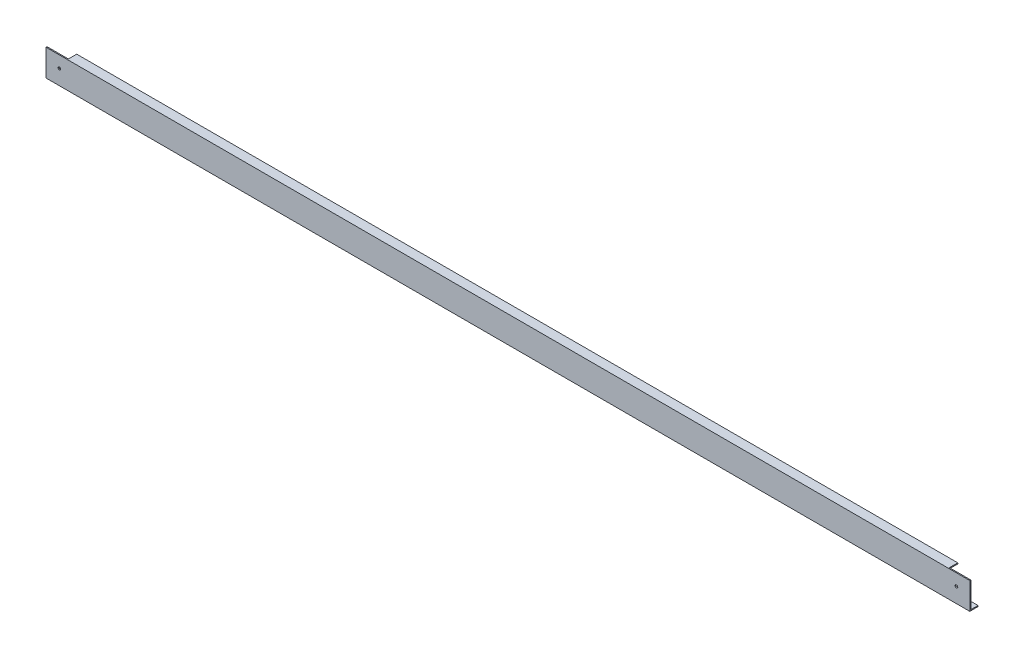
ISO-10303-21;
HEADER;
FILE_DESCRIPTION(('STEP AP214'),'2;1');
FILE_NAME('part.step','',(''),(''),'','','');
FILE_SCHEMA(('AUTOMOTIVE_DESIGN { 1 0 10303 214 1 1 1 1 }'));
ENDSEC;
DATA;
#1=APPLICATION_CONTEXT('core data for automotive mechanical design processes');
#2=APPLICATION_PROTOCOL_DEFINITION('international standard','automotive_design',2000,#1);
#3=PRODUCT_CONTEXT('',#1,'mechanical');
#4=PRODUCT('Part','Part','',(#3));
#5=PRODUCT_RELATED_PRODUCT_CATEGORY('part','',(#4));
#6=PRODUCT_DEFINITION_FORMATION('','',#4);
#7=PRODUCT_DEFINITION_CONTEXT('part definition',#1,'design');
#8=PRODUCT_DEFINITION('design','',#6,#7);
#9=PRODUCT_DEFINITION_SHAPE('','',#8);
#10=(LENGTH_UNIT() NAMED_UNIT(*) SI_UNIT(.MILLI.,.METRE.));
#11=(NAMED_UNIT(*) PLANE_ANGLE_UNIT() SI_UNIT($,.RADIAN.));
#12=(NAMED_UNIT(*) SI_UNIT($,.STERADIAN.) SOLID_ANGLE_UNIT());
#13=UNCERTAINTY_MEASURE_WITH_UNIT(LENGTH_MEASURE(1.E-05),#10,'distance_accuracy_value','');
#14=(GEOMETRIC_REPRESENTATION_CONTEXT(3) GLOBAL_UNCERTAINTY_ASSIGNED_CONTEXT((#13)) GLOBAL_UNIT_ASSIGNED_CONTEXT((#10,
#11,#12)) REPRESENTATION_CONTEXT('',''));
#15=CARTESIAN_POINT('',(0.,0.,0.));
#16=DIRECTION('',(0.,0.,1.));
#17=DIRECTION('',(1.,0.,0.));
#18=AXIS2_PLACEMENT_3D('',#15,#16,#17);
#19=CARTESIAN_POINT('',(4394.2,122.174,-4.826));
#20=DIRECTION('',(0.,1.,0.));
#21=DIRECTION('',(0.,0.,1.));
#22=AXIS2_PLACEMENT_3D('',#19,#20,#21);
#23=PLANE('',#22);
#24=DIRECTION('',(0.,0.,1.));
#25=VECTOR('',#24,1.);
#26=CARTESIAN_POINT('',(101.6,122.174,-44.451));
#27=LINE('',#26,#25);
#28=CARTESIAN_POINT('',(101.6,122.174,-44.45));
#29=VERTEX_POINT('',#28);
#30=CARTESIAN_POINT('',(101.6,122.174,-4.826));
#31=VERTEX_POINT('',#30);
#32=EDGE_CURVE('E168',#29,#31,#27,.T.);
#33=ORIENTED_EDGE('',*,*,#32,.F.);
#34=DIRECTION('',(-1.,0.,0.));
#35=VECTOR('',#34,1.);
#36=CARTESIAN_POINT('',(4394.2,122.174,-44.45));
#37=LINE('',#36,#35);
#38=CARTESIAN_POINT('',(4292.6,122.174,-44.45));
#39=VERTEX_POINT('',#38);
#40=EDGE_CURVE('E142',#39,#29,#37,.T.);
#41=ORIENTED_EDGE('',*,*,#40,.F.);
#42=DIRECTION('',(0.,0.,1.));
#43=VECTOR('',#42,1.);
#44=CARTESIAN_POINT('',(4292.6,122.174,-44.451));
#45=LINE('',#44,#43);
#46=CARTESIAN_POINT('',(4292.6,122.174,-4.826));
#47=VERTEX_POINT('',#46);
#48=EDGE_CURVE('E171',#39,#47,#45,.T.);
#49=ORIENTED_EDGE('',*,*,#48,.T.);
#50=DIRECTION('',(-1.,0.,0.));
#51=VECTOR('',#50,1.);
#52=CARTESIAN_POINT('',(4394.2,122.174,-4.826));
#53=LINE('',#52,#51);
#54=EDGE_CURVE('E109',#47,#31,#53,.T.);
#55=ORIENTED_EDGE('',*,*,#54,.T.);
#56=EDGE_LOOP('',(#33,#41,#49,#55));
#57=FACE_BOUND('',#56,.T.);
#58=ADVANCED_FACE('F35',(#57),#23,.F.);
#59=CARTESIAN_POINT('',(4394.2,127.,-44.45));
#60=DIRECTION('',(0.,0.,1.));
#61=DIRECTION('',(1.,0.,0.));
#62=AXIS2_PLACEMENT_3D('',#59,#60,#61);
#63=PLANE('',#62);
#64=DIRECTION('',(0.,1.,0.));
#65=VECTOR('',#64,1.);
#66=CARTESIAN_POINT('',(101.6,127.,-44.45));
#67=LINE('',#66,#65);
#68=CARTESIAN_POINT('',(101.6,127.,-44.45));
#69=VERTEX_POINT('',#68);
#70=EDGE_CURVE('E166',#29,#69,#67,.T.);
#71=ORIENTED_EDGE('',*,*,#70,.T.);
#72=DIRECTION('',(-1.,0.,0.));
#73=VECTOR('',#72,1.);
#74=CARTESIAN_POINT('',(4394.2,127.,-44.45));
#75=LINE('',#74,#73);
#76=CARTESIAN_POINT('',(4292.6,127.,-44.45));
#77=VERTEX_POINT('',#76);
#78=EDGE_CURVE('E139',#77,#69,#75,.T.);
#79=ORIENTED_EDGE('',*,*,#78,.F.);
#80=DIRECTION('',(0.,-1.,0.));
#81=VECTOR('',#80,1.);
#82=CARTESIAN_POINT('',(4292.6,127.,-44.45));
#83=LINE('',#82,#81);
#84=EDGE_CURVE('E178',#77,#39,#83,.T.);
#85=ORIENTED_EDGE('',*,*,#84,.T.);
#86=ORIENTED_EDGE('',*,*,#40,.T.);
#87=EDGE_LOOP('',(#71,#79,#85,#86));
#88=FACE_BOUND('',#87,.T.);
#89=ADVANCED_FACE('F210',(#88),#63,.F.);
#90=CARTESIAN_POINT('',(4394.2,127.,0.));
#91=DIRECTION('',(0.,-1.,0.));
#92=DIRECTION('',(0.,0.,-1.));
#93=AXIS2_PLACEMENT_3D('',#90,#91,#92);
#94=PLANE('',#93);
#95=DIRECTION('',(0.,0.,1.));
#96=VECTOR('',#95,1.);
#97=CARTESIAN_POINT('',(101.6,127.,-44.451));
#98=LINE('',#97,#96);
#99=CARTESIAN_POINT('',(101.6,127.,-4.826));
#100=VERTEX_POINT('',#99);
#101=EDGE_CURVE('E164',#69,#100,#98,.T.);
#102=ORIENTED_EDGE('',*,*,#101,.T.);
#103=DIRECTION('',(1.,0.,0.));
#104=VECTOR('',#103,1.);
#105=CARTESIAN_POINT('',(0.,127.,-4.826));
#106=LINE('',#105,#104);
#107=CARTESIAN_POINT('',(0.,127.,-4.826));
#108=VERTEX_POINT('',#107);
#109=EDGE_CURVE('E155',#108,#100,#106,.T.);
#110=ORIENTED_EDGE('',*,*,#109,.F.);
#111=DIRECTION('',(0.,0.,1.));
#112=VECTOR('',#111,1.);
#113=CARTESIAN_POINT('',(0.,127.,0.));
#114=LINE('',#113,#112);
#115=CARTESIAN_POINT('',(0.,127.,0.));
#116=VERTEX_POINT('',#115);
#117=EDGE_CURVE('E132',#108,#116,#114,.T.);
#118=ORIENTED_EDGE('',*,*,#117,.T.);
#119=DIRECTION('',(-1.,0.,0.));
#120=VECTOR('',#119,1.);
#121=CARTESIAN_POINT('',(4394.2,127.,0.));
#122=LINE('',#121,#120);
#123=CARTESIAN_POINT('',(4394.2,127.,0.));
#124=VERTEX_POINT('',#123);
#125=EDGE_CURVE('E137',#124,#116,#122,.T.);
#126=ORIENTED_EDGE('',*,*,#125,.F.);
#127=DIRECTION('',(0.,0.,1.));
#128=VECTOR('',#127,1.);
#129=CARTESIAN_POINT('',(4394.2,127.,0.));
#130=LINE('',#129,#128);
#131=CARTESIAN_POINT('',(4394.2,127.,-4.826));
#132=VERTEX_POINT('',#131);
#133=EDGE_CURVE('E116',#132,#124,#130,.T.);
#134=ORIENTED_EDGE('',*,*,#133,.F.);
#135=DIRECTION('',(1.,0.,0.));
#136=VECTOR('',#135,1.);
#137=CARTESIAN_POINT('',(4394.2,127.,-4.826));
#138=LINE('',#137,#136);
#139=CARTESIAN_POINT('',(4292.6,127.,-4.826));
#140=VERTEX_POINT('',#139);
#141=EDGE_CURVE('E114',#140,#132,#138,.T.);
#142=ORIENTED_EDGE('',*,*,#141,.F.);
#143=DIRECTION('',(0.,0.,1.));
#144=VECTOR('',#143,1.);
#145=CARTESIAN_POINT('',(4292.6,127.,-44.451));
#146=LINE('',#145,#144);
#147=EDGE_CURVE('E184',#77,#140,#146,.T.);
#148=ORIENTED_EDGE('',*,*,#147,.F.);
#149=ORIENTED_EDGE('',*,*,#78,.T.);
#150=EDGE_LOOP('',(#102,#110,#118,#126,#134,#142,#148,#149));
#151=FACE_BOUND('',#150,.T.);
#152=ADVANCED_FACE('F161',(#151),#94,.F.);
#153=CARTESIAN_POINT('',(4394.2,0.,0.));
#154=DIRECTION('',(-1.,0.,0.));
#155=DIRECTION('',(0.,0.,1.));
#156=AXIS2_PLACEMENT_3D('',#153,#154,#155);
#157=PLANE('',#156);
#158=DIRECTION('',(0.,1.,0.));
#159=VECTOR('',#158,1.);
#160=CARTESIAN_POINT('',(4394.2,4.826,-4.826));
#161=LINE('',#160,#159);
#162=CARTESIAN_POINT('',(4394.2,4.826,-4.826));
#163=VERTEX_POINT('',#162);
#164=EDGE_CURVE('E50',#163,#132,#161,.T.);
#165=ORIENTED_EDGE('',*,*,#164,.T.);
#166=ORIENTED_EDGE('',*,*,#133,.T.);
#167=DIRECTION('',(0.,-1.,0.));
#168=VECTOR('',#167,1.);
#169=CARTESIAN_POINT('',(4394.2,0.,0.));
#170=LINE('',#169,#168);
#171=CARTESIAN_POINT('',(4394.2,0.,0.));
#172=VERTEX_POINT('',#171);
#173=EDGE_CURVE('E57',#124,#172,#170,.T.);
#174=ORIENTED_EDGE('',*,*,#173,.T.);
#175=DIRECTION('',(0.,0.,-1.));
#176=VECTOR('',#175,1.);
#177=CARTESIAN_POINT('',(4394.2,0.,0.));
#178=LINE('',#177,#176);
#179=CARTESIAN_POINT('',(4394.2,0.,-39.0506937663231));
#180=VERTEX_POINT('',#179);
#181=EDGE_CURVE('E135',#172,#180,#178,.T.);
#182=ORIENTED_EDGE('',*,*,#181,.T.);
#183=DIRECTION('',(0.,1.,0.));
#184=VECTOR('',#183,1.);
#185=CARTESIAN_POINT('',(4394.2,4.826,-39.0506937663231));
#186=LINE('',#185,#184);
#187=CARTESIAN_POINT('',(4394.2,4.826,-39.0506937663231));
#188=VERTEX_POINT('',#187);
#189=EDGE_CURVE('E89',#180,#188,#186,.T.);
#190=ORIENTED_EDGE('',*,*,#189,.T.);
#191=DIRECTION('',(0.,0.,1.));
#192=VECTOR('',#191,1.);
#193=CARTESIAN_POINT('',(4394.2,4.826,-4.826));
#194=LINE('',#193,#192);
#195=EDGE_CURVE('E95',#188,#163,#194,.T.);
#196=ORIENTED_EDGE('',*,*,#195,.T.);
#197=EDGE_LOOP('',(#165,#166,#174,#182,#190,#196));
#198=FACE_BOUND('',#197,.T.);
#199=ADVANCED_FACE('F97',(#198),#157,.F.);
#200=CARTESIAN_POINT('',(4394.2,0.,0.));
#201=DIRECTION('',(0.,1.,0.));
#202=DIRECTION('',(0.,0.,1.));
#203=AXIS2_PLACEMENT_3D('',#200,#201,#202);
#204=PLANE('',#203);
#205=DIRECTION('',(0.,0.,-1.));
#206=VECTOR('',#205,1.);
#207=CARTESIAN_POINT('',(0.,0.,0.));
#208=LINE('',#207,#206);
#209=CARTESIAN_POINT('',(0.,0.,0.));
#210=VERTEX_POINT('',#209);
#211=CARTESIAN_POINT('',(0.,0.,-39.0506937663231));
#212=VERTEX_POINT('',#211);
#213=EDGE_CURVE('E123',#210,#212,#208,.T.);
#214=ORIENTED_EDGE('',*,*,#213,.T.);
#215=DIRECTION('',(-1.,0.,0.));
#216=VECTOR('',#215,1.);
#217=CARTESIAN_POINT('',(4394.2,0.,-39.0506937663231));
#218=LINE('',#217,#216);
#219=EDGE_CURVE('E11',#180,#212,#218,.T.);
#220=ORIENTED_EDGE('',*,*,#219,.F.);
#221=ORIENTED_EDGE('',*,*,#181,.F.);
#222=DIRECTION('',(-1.,0.,0.));
#223=VECTOR('',#222,1.);
#224=CARTESIAN_POINT('',(4394.2,0.,0.));
#225=LINE('',#224,#223);
#226=EDGE_CURVE('E122',#172,#210,#225,.T.);
#227=ORIENTED_EDGE('',*,*,#226,.T.);
#228=EDGE_LOOP('',(#214,#220,#221,#227));
#229=FACE_BOUND('',#228,.T.);
#230=ADVANCED_FACE('F37',(#229),#204,.F.);
#231=CARTESIAN_POINT('',(4394.2,4.826,-39.0506937663231));
#232=DIRECTION('',(0.,0.,1.));
#233=DIRECTION('',(1.,0.,0.));
#234=AXIS2_PLACEMENT_3D('',#231,#232,#233);
#235=PLANE('',#234);
#236=DIRECTION('',(0.,1.,0.));
#237=VECTOR('',#236,1.);
#238=CARTESIAN_POINT('',(0.,4.826,-39.0506937663231));
#239=LINE('',#238,#237);
#240=CARTESIAN_POINT('',(0.,4.826,-39.0506937663231));
#241=VERTEX_POINT('',#240);
#242=EDGE_CURVE('E126',#212,#241,#239,.T.);
#243=ORIENTED_EDGE('',*,*,#242,.T.);
#244=DIRECTION('',(-1.,0.,0.));
#245=VECTOR('',#244,1.);
#246=CARTESIAN_POINT('',(4394.2,4.826,-39.0506937663231));
#247=LINE('',#246,#245);
#248=EDGE_CURVE('E43',#188,#241,#247,.T.);
#249=ORIENTED_EDGE('',*,*,#248,.F.);
#250=ORIENTED_EDGE('',*,*,#189,.F.);
#251=ORIENTED_EDGE('',*,*,#219,.T.);
#252=EDGE_LOOP('',(#243,#249,#250,#251));
#253=FACE_BOUND('',#252,.T.);
#254=ADVANCED_FACE('F202',(#253),#235,.F.);
#255=CARTESIAN_POINT('',(4394.2,4.826,-4.826));
#256=DIRECTION('',(0.,-1.,0.));
#257=DIRECTION('',(0.,0.,-1.));
#258=AXIS2_PLACEMENT_3D('',#255,#256,#257);
#259=PLANE('',#258);
#260=DIRECTION('',(0.,0.,1.));
#261=VECTOR('',#260,1.);
#262=CARTESIAN_POINT('',(0.,4.826,-4.826));
#263=LINE('',#262,#261);
#264=CARTESIAN_POINT('',(0.,4.826,-4.826));
#265=VERTEX_POINT('',#264);
#266=EDGE_CURVE('E105',#241,#265,#263,.T.);
#267=ORIENTED_EDGE('',*,*,#266,.T.);
#268=DIRECTION('',(-1.,0.,0.));
#269=VECTOR('',#268,1.);
#270=CARTESIAN_POINT('',(4394.2,4.826,-4.826));
#271=LINE('',#270,#269);
#272=EDGE_CURVE('E102',#163,#265,#271,.T.);
#273=ORIENTED_EDGE('',*,*,#272,.F.);
#274=ORIENTED_EDGE('',*,*,#195,.F.);
#275=ORIENTED_EDGE('',*,*,#248,.T.);
#276=EDGE_LOOP('',(#267,#273,#274,#275));
#277=FACE_BOUND('',#276,.T.);
#278=ADVANCED_FACE('F103',(#277),#259,.F.);
#279=CARTESIAN_POINT('',(4394.2,4.826,-4.826));
#280=DIRECTION('',(0.,0.,1.));
#281=DIRECTION('',(1.,0.,0.));
#282=AXIS2_PLACEMENT_3D('',#279,#280,#281);
#283=PLANE('',#282);
#284=CARTESIAN_POINT('',(4330.7,71.12,-4.826));
#285=DIRECTION('',(0.,0.,-1.));
#286=DIRECTION('',(-1.,0.,0.));
#287=AXIS2_PLACEMENT_3D('',#284,#285,#286);
#288=CIRCLE('',#287,6.35000000000018);
#289=CARTESIAN_POINT('',(4324.35,71.12,-4.826));
#290=VERTEX_POINT('',#289);
#291=EDGE_CURVE('E189',#290,#290,#288,.T.);
#292=ORIENTED_EDGE('',*,*,#291,.F.);
#293=EDGE_LOOP('',(#292));
#294=FACE_BOUND('',#293,.T.);
#295=CARTESIAN_POINT('',(63.5,71.12,-4.826));
#296=DIRECTION('',(0.,0.,-1.));
#297=DIRECTION('',(-1.,0.,0.));
#298=AXIS2_PLACEMENT_3D('',#295,#296,#297);
#299=CIRCLE('',#298,6.35);
#300=CARTESIAN_POINT('',(57.15,71.12,-4.826));
#301=VERTEX_POINT('',#300);
#302=EDGE_CURVE('E177',#301,#301,#299,.T.);
#303=ORIENTED_EDGE('',*,*,#302,.F.);
#304=EDGE_LOOP('',(#303));
#305=FACE_BOUND('',#304,.T.);
#306=DIRECTION('',(0.,1.,0.));
#307=VECTOR('',#306,1.);
#308=CARTESIAN_POINT('',(0.,4.826,-4.826));
#309=LINE('',#308,#307);
#310=EDGE_CURVE('E130',#265,#108,#309,.T.);
#311=ORIENTED_EDGE('',*,*,#310,.T.);
#312=ORIENTED_EDGE('',*,*,#109,.T.);
#313=DIRECTION('',(0.,-1.,0.));
#314=VECTOR('',#313,1.);
#315=CARTESIAN_POINT('',(101.6,127.,-4.826));
#316=LINE('',#315,#314);
#317=EDGE_CURVE('E165',#100,#31,#316,.T.);
#318=ORIENTED_EDGE('',*,*,#317,.T.);
#319=ORIENTED_EDGE('',*,*,#54,.F.);
#320=DIRECTION('',(0.,1.,0.));
#321=VECTOR('',#320,1.);
#322=CARTESIAN_POINT('',(4292.6,127.,-4.826));
#323=LINE('',#322,#321);
#324=EDGE_CURVE('E181',#47,#140,#323,.T.);
#325=ORIENTED_EDGE('',*,*,#324,.T.);
#326=ORIENTED_EDGE('',*,*,#141,.T.);
#327=ORIENTED_EDGE('',*,*,#164,.F.);
#328=ORIENTED_EDGE('',*,*,#272,.T.);
#329=EDGE_LOOP('',(#311,#312,#318,#319,#325,#326,#327,#328));
#330=FACE_BOUND('',#329,.T.);
#331=ADVANCED_FACE('F111',(#294,#305,#330),#283,.F.);
#332=CARTESIAN_POINT('',(4394.2,0.,0.));
#333=DIRECTION('',(0.,0.,-1.));
#334=DIRECTION('',(-1.,0.,0.));
#335=AXIS2_PLACEMENT_3D('',#332,#333,#334);
#336=PLANE('',#335);
#337=CARTESIAN_POINT('',(4330.7,71.12,0.));
#338=DIRECTION('',(0.,0.,-1.));
#339=DIRECTION('',(-1.,0.,0.));
#340=AXIS2_PLACEMENT_3D('',#337,#338,#339);
#341=CIRCLE('',#340,6.35000000000018);
#342=CARTESIAN_POINT('',(4324.35,71.12,0.));
#343=VERTEX_POINT('',#342);
#344=EDGE_CURVE('E127',#343,#343,#341,.F.);
#345=ORIENTED_EDGE('',*,*,#344,.F.);
#346=EDGE_LOOP('',(#345));
#347=FACE_BOUND('',#346,.T.);
#348=CARTESIAN_POINT('',(63.5,71.12,0.));
#349=DIRECTION('',(0.,0.,-1.));
#350=DIRECTION('',(-1.,0.,0.));
#351=AXIS2_PLACEMENT_3D('',#348,#349,#350);
#352=CIRCLE('',#351,6.35);
#353=CARTESIAN_POINT('',(57.15,71.12,0.));
#354=VERTEX_POINT('',#353);
#355=EDGE_CURVE('E192',#354,#354,#352,.F.);
#356=ORIENTED_EDGE('',*,*,#355,.F.);
#357=EDGE_LOOP('',(#356));
#358=FACE_BOUND('',#357,.T.);
#359=DIRECTION('',(0.,-1.,0.));
#360=VECTOR('',#359,1.);
#361=CARTESIAN_POINT('',(0.,0.,0.));
#362=LINE('',#361,#360);
#363=EDGE_CURVE('E81',#116,#210,#362,.T.);
#364=ORIENTED_EDGE('',*,*,#363,.T.);
#365=ORIENTED_EDGE('',*,*,#226,.F.);
#366=ORIENTED_EDGE('',*,*,#173,.F.);
#367=ORIENTED_EDGE('',*,*,#125,.T.);
#368=EDGE_LOOP('',(#364,#365,#366,#367));
#369=FACE_BOUND('',#368,.T.);
#370=ADVANCED_FACE('F222',(#347,#358,#369),#336,.F.);
#371=CARTESIAN_POINT('',(0.,0.,0.));
#372=DIRECTION('',(-1.,0.,0.));
#373=DIRECTION('',(0.,0.,1.));
#374=AXIS2_PLACEMENT_3D('',#371,#372,#373);
#375=PLANE('',#374);
#376=ORIENTED_EDGE('',*,*,#117,.F.);
#377=ORIENTED_EDGE('',*,*,#310,.F.);
#378=ORIENTED_EDGE('',*,*,#266,.F.);
#379=ORIENTED_EDGE('',*,*,#242,.F.);
#380=ORIENTED_EDGE('',*,*,#213,.F.);
#381=ORIENTED_EDGE('',*,*,#363,.F.);
#382=EDGE_LOOP('',(#376,#377,#378,#379,#380,#381));
#383=FACE_BOUND('',#382,.T.);
#384=ADVANCED_FACE('F148',(#383),#375,.T.);
#385=CARTESIAN_POINT('',(63.5,71.12,0.00100000000000013));
#386=DIRECTION('',(0.,0.,-1.));
#387=DIRECTION('',(-1.,0.,0.));
#388=AXIS2_PLACEMENT_3D('',#385,#386,#387);
#389=CYLINDRICAL_SURFACE('',#388,6.35);
#390=ORIENTED_EDGE('',*,*,#302,.T.);
#391=EDGE_LOOP('',(#390));
#392=FACE_BOUND('',#391,.T.);
#393=ORIENTED_EDGE('',*,*,#355,.T.);
#394=EDGE_LOOP('',(#393));
#395=FACE_BOUND('',#394,.T.);
#396=ADVANCED_FACE('F233',(#392,#395),#389,.F.);
#397=CARTESIAN_POINT('',(4330.7,71.12,0.00100000000000013));
#398=DIRECTION('',(0.,0.,-1.));
#399=DIRECTION('',(-1.,0.,0.));
#400=AXIS2_PLACEMENT_3D('',#397,#398,#399);
#401=CYLINDRICAL_SURFACE('',#400,6.35000000000018);
#402=ORIENTED_EDGE('',*,*,#291,.T.);
#403=EDGE_LOOP('',(#402));
#404=FACE_BOUND('',#403,.T.);
#405=ORIENTED_EDGE('',*,*,#344,.T.);
#406=EDGE_LOOP('',(#405));
#407=FACE_BOUND('',#406,.T.);
#408=ADVANCED_FACE('F236',(#404,#407),#401,.F.);
#409=CARTESIAN_POINT('',(101.6,127.,-44.451));
#410=DIRECTION('',(-1.,0.,0.));
#411=DIRECTION('',(0.,-1.,0.));
#412=AXIS2_PLACEMENT_3D('',#409,#410,#411);
#413=PLANE('',#412);
#414=ORIENTED_EDGE('',*,*,#32,.T.);
#415=ORIENTED_EDGE('',*,*,#317,.F.);
#416=ORIENTED_EDGE('',*,*,#101,.F.);
#417=ORIENTED_EDGE('',*,*,#70,.F.);
#418=EDGE_LOOP('',(#414,#415,#416,#417));
#419=FACE_BOUND('',#418,.T.);
#420=ADVANCED_FACE('F244',(#419),#413,.T.);
#421=CARTESIAN_POINT('',(4292.6,127.,-44.451));
#422=DIRECTION('',(1.,0.,0.));
#423=DIRECTION('',(0.,0.,-1.));
#424=AXIS2_PLACEMENT_3D('',#421,#422,#423);
#425=PLANE('',#424);
#426=ORIENTED_EDGE('',*,*,#147,.T.);
#427=ORIENTED_EDGE('',*,*,#324,.F.);
#428=ORIENTED_EDGE('',*,*,#48,.F.);
#429=ORIENTED_EDGE('',*,*,#84,.F.);
#430=EDGE_LOOP('',(#426,#427,#428,#429));
#431=FACE_BOUND('',#430,.T.);
#432=ADVANCED_FACE('F321',(#431),#425,.T.);
#433=CLOSED_SHELL('',(#58,#89,#152,#199,#230,#254,#278,#331,#370,#384,#396,#408,#420,#432));
#434=MANIFOLD_SOLID_BREP('B2',#433);
#435=ADVANCED_BREP_SHAPE_REPRESENTATION('',(#18,#434),#14);
#436=SHAPE_DEFINITION_REPRESENTATION(#9,#435);
ENDSEC;
END-ISO-10303-21;
